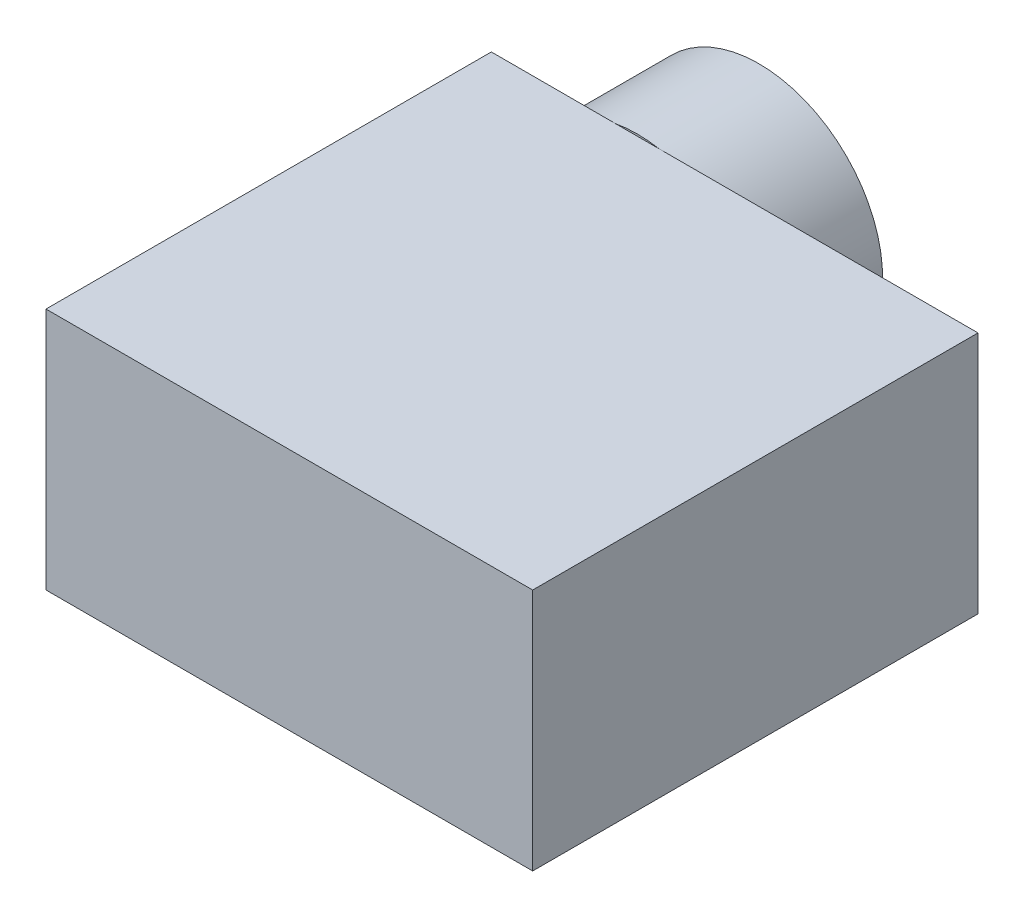
ISO-10303-21;
HEADER;
FILE_DESCRIPTION(('STEP AP214'),'2;1');
FILE_NAME('part.step','',(''),(''),'','','');
FILE_SCHEMA(('AUTOMOTIVE_DESIGN { 1 0 10303 214 1 1 1 1 }'));
ENDSEC;
DATA;
#1=APPLICATION_CONTEXT('core data for automotive mechanical design processes');
#2=APPLICATION_PROTOCOL_DEFINITION('international standard','automotive_design',2000,#1);
#3=PRODUCT_CONTEXT('',#1,'mechanical');
#4=PRODUCT('Part','Part','',(#3));
#5=PRODUCT_RELATED_PRODUCT_CATEGORY('part','',(#4));
#6=PRODUCT_DEFINITION_FORMATION('','',#4);
#7=PRODUCT_DEFINITION_CONTEXT('part definition',#1,'design');
#8=PRODUCT_DEFINITION('design','',#6,#7);
#9=PRODUCT_DEFINITION_SHAPE('','',#8);
#10=(LENGTH_UNIT() NAMED_UNIT(*) SI_UNIT(.MILLI.,.METRE.));
#11=(NAMED_UNIT(*) PLANE_ANGLE_UNIT() SI_UNIT($,.RADIAN.));
#12=(NAMED_UNIT(*) SI_UNIT($,.STERADIAN.) SOLID_ANGLE_UNIT());
#13=UNCERTAINTY_MEASURE_WITH_UNIT(LENGTH_MEASURE(1.E-05),#10,'distance_accuracy_value','');
#14=(GEOMETRIC_REPRESENTATION_CONTEXT(3) GLOBAL_UNCERTAINTY_ASSIGNED_CONTEXT((#13)) GLOBAL_UNIT_ASSIGNED_CONTEXT((#10,
#11,#12)) REPRESENTATION_CONTEXT('',''));
#15=CARTESIAN_POINT('',(0.,0.,0.));
#16=DIRECTION('',(0.,0.,1.));
#17=DIRECTION('',(1.,0.,0.));
#18=AXIS2_PLACEMENT_3D('',#15,#16,#17);
#19=CARTESIAN_POINT('',(-12.,10.,-10.));
#20=DIRECTION('',(0.,0.,1.));
#21=DIRECTION('',(1.,0.,0.));
#22=AXIS2_PLACEMENT_3D('',#19,#20,#21);
#23=PLANE('',#22);
#24=CARTESIAN_POINT('',(0.,0.,-10.));
#25=DIRECTION('',(0.,0.,-1.));
#26=DIRECTION('',(-1.,0.,0.));
#27=AXIS2_PLACEMENT_3D('',#24,#25,#26);
#28=CIRCLE('',#27,10.16);
#29=CARTESIAN_POINT('',(1.7959955456515,10.,-10.));
#30=VERTEX_POINT('',#29);
#31=CARTESIAN_POINT('',(1.7959955456515,-10.,-10.));
#32=VERTEX_POINT('',#31);
#33=EDGE_CURVE('E11',#30,#32,#28,.T.);
#34=ORIENTED_EDGE('',*,*,#33,.F.);
#35=DIRECTION('',(-1.,0.,0.));
#36=VECTOR('',#35,1.);
#37=CARTESIAN_POINT('',(-12.,10.,-10.));
#38=LINE('',#37,#36);
#39=CARTESIAN_POINT('',(28.,10.,-10.));
#40=VERTEX_POINT('',#39);
#41=EDGE_CURVE('E101',#40,#30,#38,.T.);
#42=ORIENTED_EDGE('',*,*,#41,.F.);
#43=DIRECTION('',(0.,-1.,0.));
#44=VECTOR('',#43,1.);
#45=CARTESIAN_POINT('',(28.,10.,-10.));
#46=LINE('',#45,#44);
#47=CARTESIAN_POINT('',(28.,-10.,-10.));
#48=VERTEX_POINT('',#47);
#49=EDGE_CURVE('E150',#40,#48,#46,.T.);
#50=ORIENTED_EDGE('',*,*,#49,.T.);
#51=DIRECTION('',(-1.,0.,0.));
#52=VECTOR('',#51,1.);
#53=CARTESIAN_POINT('',(-12.,-10.,-10.));
#54=LINE('',#53,#52);
#55=EDGE_CURVE('E131',#48,#32,#54,.T.);
#56=ORIENTED_EDGE('',*,*,#55,.T.);
#57=EDGE_LOOP('',(#34,#42,#50,#56));
#58=FACE_BOUND('',#57,.T.);
#59=ADVANCED_FACE('F41',(#58),#23,.F.);
#60=CARTESIAN_POINT('',(-1.79599554565149,-10.,-10.));
#61=VERTEX_POINT('',#60);
#62=CARTESIAN_POINT('',(-1.79599554565149,10.,-10.));
#63=VERTEX_POINT('',#62);
#64=EDGE_CURVE('E50',#61,#63,#28,.T.);
#65=ORIENTED_EDGE('',*,*,#64,.F.);
#66=CARTESIAN_POINT('',(-12.,-10.,-10.));
#67=VERTEX_POINT('',#66);
#68=EDGE_CURVE('E145',#61,#67,#54,.T.);
#69=ORIENTED_EDGE('',*,*,#68,.T.);
#70=DIRECTION('',(0.,-1.,0.));
#71=VECTOR('',#70,1.);
#72=CARTESIAN_POINT('',(-12.,10.,-10.));
#73=LINE('',#72,#71);
#74=CARTESIAN_POINT('',(-12.,10.,-10.));
#75=VERTEX_POINT('',#74);
#76=EDGE_CURVE('E109',#75,#67,#73,.T.);
#77=ORIENTED_EDGE('',*,*,#76,.F.);
#78=EDGE_CURVE('E99',#63,#75,#38,.T.);
#79=ORIENTED_EDGE('',*,*,#78,.F.);
#80=EDGE_LOOP('',(#65,#69,#77,#79));
#81=FACE_BOUND('',#80,.T.);
#82=ADVANCED_FACE('F107',(#81),#23,.F.);
#83=CARTESIAN_POINT('',(-12.,10.,-10.));
#84=DIRECTION('',(1.,0.,0.));
#85=DIRECTION('',(0.,0.,-1.));
#86=AXIS2_PLACEMENT_3D('',#83,#84,#85);
#87=PLANE('',#86);
#88=DIRECTION('',(0.,0.,1.));
#89=VECTOR('',#88,1.);
#90=CARTESIAN_POINT('',(-12.,-10.,-10.));
#91=LINE('',#90,#89);
#92=CARTESIAN_POINT('',(-12.,-10.,26.6));
#93=VERTEX_POINT('',#92);
#94=EDGE_CURVE('E124',#67,#93,#91,.T.);
#95=ORIENTED_EDGE('',*,*,#94,.T.);
#96=DIRECTION('',(0.,-1.,0.));
#97=VECTOR('',#96,1.);
#98=CARTESIAN_POINT('',(-12.,10.,26.6));
#99=LINE('',#98,#97);
#100=CARTESIAN_POINT('',(-12.,10.,26.6));
#101=VERTEX_POINT('',#100);
#102=EDGE_CURVE('E45',#101,#93,#99,.T.);
#103=ORIENTED_EDGE('',*,*,#102,.F.);
#104=DIRECTION('',(0.,0.,1.));
#105=VECTOR('',#104,1.);
#106=CARTESIAN_POINT('',(-12.,10.,-10.));
#107=LINE('',#106,#105);
#108=EDGE_CURVE('E127',#75,#101,#107,.T.);
#109=ORIENTED_EDGE('',*,*,#108,.F.);
#110=ORIENTED_EDGE('',*,*,#76,.T.);
#111=EDGE_LOOP('',(#95,#103,#109,#110));
#112=FACE_BOUND('',#111,.T.);
#113=ADVANCED_FACE('F43',(#112),#87,.F.);
#114=CARTESIAN_POINT('',(-12.,10.,26.6));
#115=DIRECTION('',(0.,0.,-1.));
#116=DIRECTION('',(-1.,0.,0.));
#117=AXIS2_PLACEMENT_3D('',#114,#115,#116);
#118=PLANE('',#117);
#119=DIRECTION('',(1.,0.,0.));
#120=VECTOR('',#119,1.);
#121=CARTESIAN_POINT('',(-12.,-10.,26.6));
#122=LINE('',#121,#120);
#123=CARTESIAN_POINT('',(28.,-10.,26.6));
#124=VERTEX_POINT('',#123);
#125=EDGE_CURVE('E139',#93,#124,#122,.T.);
#126=ORIENTED_EDGE('',*,*,#125,.T.);
#127=DIRECTION('',(0.,-1.,0.));
#128=VECTOR('',#127,1.);
#129=CARTESIAN_POINT('',(28.,10.,26.6));
#130=LINE('',#129,#128);
#131=CARTESIAN_POINT('',(28.,10.,26.6));
#132=VERTEX_POINT('',#131);
#133=EDGE_CURVE('E153',#132,#124,#130,.T.);
#134=ORIENTED_EDGE('',*,*,#133,.F.);
#135=DIRECTION('',(1.,0.,0.));
#136=VECTOR('',#135,1.);
#137=CARTESIAN_POINT('',(-12.,10.,26.6));
#138=LINE('',#137,#136);
#139=EDGE_CURVE('E130',#101,#132,#138,.T.);
#140=ORIENTED_EDGE('',*,*,#139,.F.);
#141=ORIENTED_EDGE('',*,*,#102,.T.);
#142=EDGE_LOOP('',(#126,#134,#140,#141));
#143=FACE_BOUND('',#142,.T.);
#144=ADVANCED_FACE('F162',(#143),#118,.F.);
#145=CARTESIAN_POINT('',(28.,10.,-10.));
#146=DIRECTION('',(-1.,0.,0.));
#147=DIRECTION('',(0.,0.,1.));
#148=AXIS2_PLACEMENT_3D('',#145,#146,#147);
#149=PLANE('',#148);
#150=DIRECTION('',(0.,0.,-1.));
#151=VECTOR('',#150,1.);
#152=CARTESIAN_POINT('',(28.,-10.,-10.));
#153=LINE('',#152,#151);
#154=EDGE_CURVE('E142',#124,#48,#153,.T.);
#155=ORIENTED_EDGE('',*,*,#154,.T.);
#156=ORIENTED_EDGE('',*,*,#49,.F.);
#157=DIRECTION('',(0.,0.,-1.));
#158=VECTOR('',#157,1.);
#159=CARTESIAN_POINT('',(28.,10.,-10.));
#160=LINE('',#159,#158);
#161=EDGE_CURVE('E111',#132,#40,#160,.T.);
#162=ORIENTED_EDGE('',*,*,#161,.F.);
#163=ORIENTED_EDGE('',*,*,#133,.T.);
#164=EDGE_LOOP('',(#155,#156,#162,#163));
#165=FACE_BOUND('',#164,.T.);
#166=ADVANCED_FACE('F170',(#165),#149,.F.);
#167=CARTESIAN_POINT('',(0.,10.,0.));
#168=DIRECTION('',(0.,1.,0.));
#169=DIRECTION('',(0.,0.,1.));
#170=AXIS2_PLACEMENT_3D('',#167,#168,#169);
#171=PLANE('',#170);
#172=ORIENTED_EDGE('',*,*,#108,.T.);
#173=ORIENTED_EDGE('',*,*,#139,.T.);
#174=ORIENTED_EDGE('',*,*,#161,.T.);
#175=ORIENTED_EDGE('',*,*,#41,.T.);
#176=EDGE_CURVE('E96',#30,#63,#38,.T.);
#177=ORIENTED_EDGE('',*,*,#176,.T.);
#178=ORIENTED_EDGE('',*,*,#78,.T.);
#179=EDGE_LOOP('',(#172,#173,#174,#175,#177,#178));
#180=FACE_BOUND('',#179,.T.);
#181=ADVANCED_FACE('F98',(#180),#171,.T.);
#182=CARTESIAN_POINT('',(0.,-10.,0.));
#183=DIRECTION('',(0.,1.,0.));
#184=DIRECTION('',(0.,0.,1.));
#185=AXIS2_PLACEMENT_3D('',#182,#183,#184);
#186=PLANE('',#185);
#187=ORIENTED_EDGE('',*,*,#94,.F.);
#188=ORIENTED_EDGE('',*,*,#68,.F.);
#189=EDGE_CURVE('E147',#32,#61,#54,.T.);
#190=ORIENTED_EDGE('',*,*,#189,.F.);
#191=ORIENTED_EDGE('',*,*,#55,.F.);
#192=ORIENTED_EDGE('',*,*,#154,.F.);
#193=ORIENTED_EDGE('',*,*,#125,.F.);
#194=EDGE_LOOP('',(#187,#188,#190,#191,#192,#193));
#195=FACE_BOUND('',#194,.T.);
#196=ADVANCED_FACE('F166',(#195),#186,.F.);
#197=CARTESIAN_POINT('',(0.,0.,-10.));
#198=DIRECTION('',(0.,0.,-1.));
#199=DIRECTION('',(-1.,0.,0.));
#200=AXIS2_PLACEMENT_3D('',#197,#198,#199);
#201=PLANE('',#200);
#202=EDGE_CURVE('E52',#32,#61,#28,.T.);
#203=ORIENTED_EDGE('',*,*,#202,.F.);
#204=ORIENTED_EDGE('',*,*,#189,.T.);
#205=EDGE_LOOP('',(#203,#204));
#206=FACE_BOUND('',#205,.T.);
#207=ADVANCED_FACE('F172',(#206),#201,.F.);
#208=CARTESIAN_POINT('',(0.,0.,-20.));
#209=DIRECTION('',(0.,0.,1.));
#210=DIRECTION('',(1.,0.,0.));
#211=AXIS2_PLACEMENT_3D('',#208,#209,#210);
#212=CYLINDRICAL_SURFACE('',#211,10.16);
#213=CARTESIAN_POINT('',(0.,0.,-20.));
#214=DIRECTION('',(0.,0.,-1.));
#215=DIRECTION('',(-1.,0.,0.));
#216=AXIS2_PLACEMENT_3D('',#213,#214,#215);
#217=CIRCLE('',#216,10.16);
#218=CARTESIAN_POINT('',(-10.16,0.,-20.));
#219=VERTEX_POINT('',#218);
#220=EDGE_CURVE('E120',#219,#219,#217,.T.);
#221=ORIENTED_EDGE('',*,*,#220,.F.);
#222=EDGE_LOOP('',(#221));
#223=FACE_BOUND('',#222,.T.);
#224=EDGE_CURVE('E115',#63,#30,#28,.T.);
#225=ORIENTED_EDGE('',*,*,#224,.T.);
#226=ORIENTED_EDGE('',*,*,#33,.T.);
#227=ORIENTED_EDGE('',*,*,#202,.T.);
#228=ORIENTED_EDGE('',*,*,#64,.T.);
#229=EDGE_LOOP('',(#225,#226,#227,#228));
#230=FACE_BOUND('',#229,.T.);
#231=ADVANCED_FACE('F114',(#223,#230),#212,.T.);
#232=CARTESIAN_POINT('',(0.,0.,-20.));
#233=DIRECTION('',(0.,0.,-1.));
#234=DIRECTION('',(-1.,0.,0.));
#235=AXIS2_PLACEMENT_3D('',#232,#233,#234);
#236=PLANE('',#235);
#237=ORIENTED_EDGE('',*,*,#220,.T.);
#238=EDGE_LOOP('',(#237));
#239=FACE_BOUND('',#238,.T.);
#240=ADVANCED_FACE('F179',(#239),#236,.T.);
#241=ORIENTED_EDGE('',*,*,#176,.F.);
#242=ORIENTED_EDGE('',*,*,#224,.F.);
#243=EDGE_LOOP('',(#241,#242));
#244=FACE_BOUND('',#243,.T.);
#245=ADVANCED_FACE('F118',(#244),#201,.F.);
#246=CLOSED_SHELL('',(#59,#82,#113,#144,#166,#181,#196,#207,#231,#240,#245));
#247=MANIFOLD_SOLID_BREP('B2',#246);
#248=ADVANCED_BREP_SHAPE_REPRESENTATION('',(#18,#247),#14);
#249=SHAPE_DEFINITION_REPRESENTATION(#9,#248);
ENDSEC;
END-ISO-10303-21;
